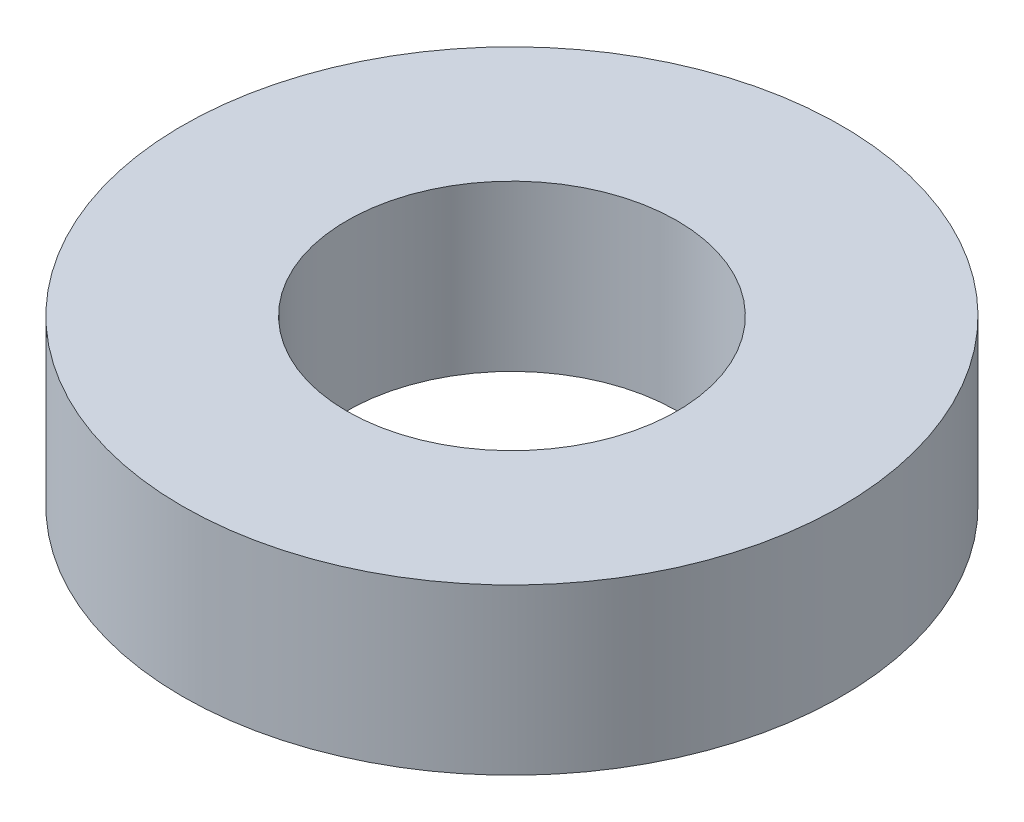
ISO-10303-21;
HEADER;
FILE_DESCRIPTION(('STEP AP214'),'2;1');
FILE_NAME('part.step','',(''),(''),'','','');
FILE_SCHEMA(('AUTOMOTIVE_DESIGN { 1 0 10303 214 1 1 1 1 }'));
ENDSEC;
DATA;
#1=APPLICATION_CONTEXT('core data for automotive mechanical design processes');
#2=APPLICATION_PROTOCOL_DEFINITION('international standard','automotive_design',2000,#1);
#3=PRODUCT_CONTEXT('',#1,'mechanical');
#4=PRODUCT('Part','Part','',(#3));
#5=PRODUCT_RELATED_PRODUCT_CATEGORY('part','',(#4));
#6=PRODUCT_DEFINITION_FORMATION('','',#4);
#7=PRODUCT_DEFINITION_CONTEXT('part definition',#1,'design');
#8=PRODUCT_DEFINITION('design','',#6,#7);
#9=PRODUCT_DEFINITION_SHAPE('','',#8);
#10=(LENGTH_UNIT() NAMED_UNIT(*) SI_UNIT(.MILLI.,.METRE.));
#11=(NAMED_UNIT(*) PLANE_ANGLE_UNIT() SI_UNIT($,.RADIAN.));
#12=(NAMED_UNIT(*) SI_UNIT($,.STERADIAN.) SOLID_ANGLE_UNIT());
#13=UNCERTAINTY_MEASURE_WITH_UNIT(LENGTH_MEASURE(1.E-05),#10,'distance_accuracy_value','');
#14=(GEOMETRIC_REPRESENTATION_CONTEXT(3) GLOBAL_UNCERTAINTY_ASSIGNED_CONTEXT((#13)) GLOBAL_UNIT_ASSIGNED_CONTEXT((#10,
#11,#12)) REPRESENTATION_CONTEXT('',''));
#15=CARTESIAN_POINT('',(0.,0.,0.));
#16=DIRECTION('',(0.,0.,1.));
#17=DIRECTION('',(1.,0.,0.));
#18=AXIS2_PLACEMENT_3D('',#15,#16,#17);
#19=CARTESIAN_POINT('',(0.,12.7,0.));
#20=DIRECTION('',(0.,1.,0.));
#21=DIRECTION('',(0.,0.,1.));
#22=AXIS2_PLACEMENT_3D('',#19,#20,#21);
#23=PLANE('',#22);
#24=CARTESIAN_POINT('',(0.,12.7,0.));
#25=DIRECTION('',(0.,1.,0.));
#26=DIRECTION('',(0.,0.,1.));
#27=AXIS2_PLACEMENT_3D('',#24,#25,#26);
#28=CIRCLE('',#27,25.4);
#29=CARTESIAN_POINT('',(0.,12.7,25.4));
#30=VERTEX_POINT('',#29);
#31=EDGE_CURVE('E10',#30,#30,#28,.T.);
#32=ORIENTED_EDGE('',*,*,#31,.T.);
#33=EDGE_LOOP('',(#32));
#34=FACE_BOUND('',#33,.T.);
#35=CARTESIAN_POINT('',(0.,12.7,0.));
#36=DIRECTION('',(0.,1.,0.));
#37=DIRECTION('',(0.,0.,1.));
#38=AXIS2_PLACEMENT_3D('',#35,#36,#37);
#39=CIRCLE('',#38,12.720955);
#40=CARTESIAN_POINT('',(0.,12.7,12.720955));
#41=VERTEX_POINT('',#40);
#42=EDGE_CURVE('E48',#41,#41,#39,.T.);
#43=ORIENTED_EDGE('',*,*,#42,.F.);
#44=EDGE_LOOP('',(#43));
#45=FACE_BOUND('',#44,.T.);
#46=ADVANCED_FACE('F37',(#34,#45),#23,.T.);
#47=CARTESIAN_POINT('',(0.,0.,0.));
#48=DIRECTION('',(0.,1.,0.));
#49=DIRECTION('',(0.,0.,1.));
#50=AXIS2_PLACEMENT_3D('',#47,#48,#49);
#51=PLANE('',#50);
#52=CARTESIAN_POINT('',(0.,0.,0.));
#53=DIRECTION('',(0.,1.,0.));
#54=DIRECTION('',(0.,0.,1.));
#55=AXIS2_PLACEMENT_3D('',#52,#53,#54);
#56=CIRCLE('',#55,25.4);
#57=CARTESIAN_POINT('',(0.,0.,25.4));
#58=VERTEX_POINT('',#57);
#59=EDGE_CURVE('E41',#58,#58,#56,.T.);
#60=ORIENTED_EDGE('',*,*,#59,.F.);
#61=EDGE_LOOP('',(#60));
#62=FACE_BOUND('',#61,.T.);
#63=CARTESIAN_POINT('',(0.,0.,0.));
#64=DIRECTION('',(0.,1.,0.));
#65=DIRECTION('',(0.,0.,1.));
#66=AXIS2_PLACEMENT_3D('',#63,#64,#65);
#67=CIRCLE('',#66,12.720955);
#68=CARTESIAN_POINT('',(0.,0.,12.720955));
#69=VERTEX_POINT('',#68);
#70=EDGE_CURVE('E50',#69,#69,#67,.T.);
#71=ORIENTED_EDGE('',*,*,#70,.T.);
#72=EDGE_LOOP('',(#71));
#73=FACE_BOUND('',#72,.T.);
#74=ADVANCED_FACE('F60',(#62,#73),#51,.F.);
#75=CARTESIAN_POINT('',(0.,12.7,0.));
#76=DIRECTION('',(0.,-1.,0.));
#77=DIRECTION('',(0.,0.,-1.));
#78=AXIS2_PLACEMENT_3D('',#75,#76,#77);
#79=CYLINDRICAL_SURFACE('',#78,25.4);
#80=ORIENTED_EDGE('',*,*,#31,.F.);
#81=EDGE_LOOP('',(#80));
#82=FACE_BOUND('',#81,.T.);
#83=ORIENTED_EDGE('',*,*,#59,.T.);
#84=EDGE_LOOP('',(#83));
#85=FACE_BOUND('',#84,.T.);
#86=ADVANCED_FACE('F39',(#82,#85),#79,.T.);
#87=CARTESIAN_POINT('',(0.,12.7,0.));
#88=DIRECTION('',(0.,-1.,0.));
#89=DIRECTION('',(0.,0.,-1.));
#90=AXIS2_PLACEMENT_3D('',#87,#88,#89);
#91=CYLINDRICAL_SURFACE('',#90,12.720955);
#92=ORIENTED_EDGE('',*,*,#42,.T.);
#93=EDGE_LOOP('',(#92));
#94=FACE_BOUND('',#93,.T.);
#95=ORIENTED_EDGE('',*,*,#70,.F.);
#96=EDGE_LOOP('',(#95));
#97=FACE_BOUND('',#96,.T.);
#98=ADVANCED_FACE('F56',(#94,#97),#91,.F.);
#99=CLOSED_SHELL('',(#46,#74,#86,#98));
#100=MANIFOLD_SOLID_BREP('B2',#99);
#101=ADVANCED_BREP_SHAPE_REPRESENTATION('',(#18,#100),#14);
#102=SHAPE_DEFINITION_REPRESENTATION(#9,#101);
ENDSEC;
END-ISO-10303-21;
